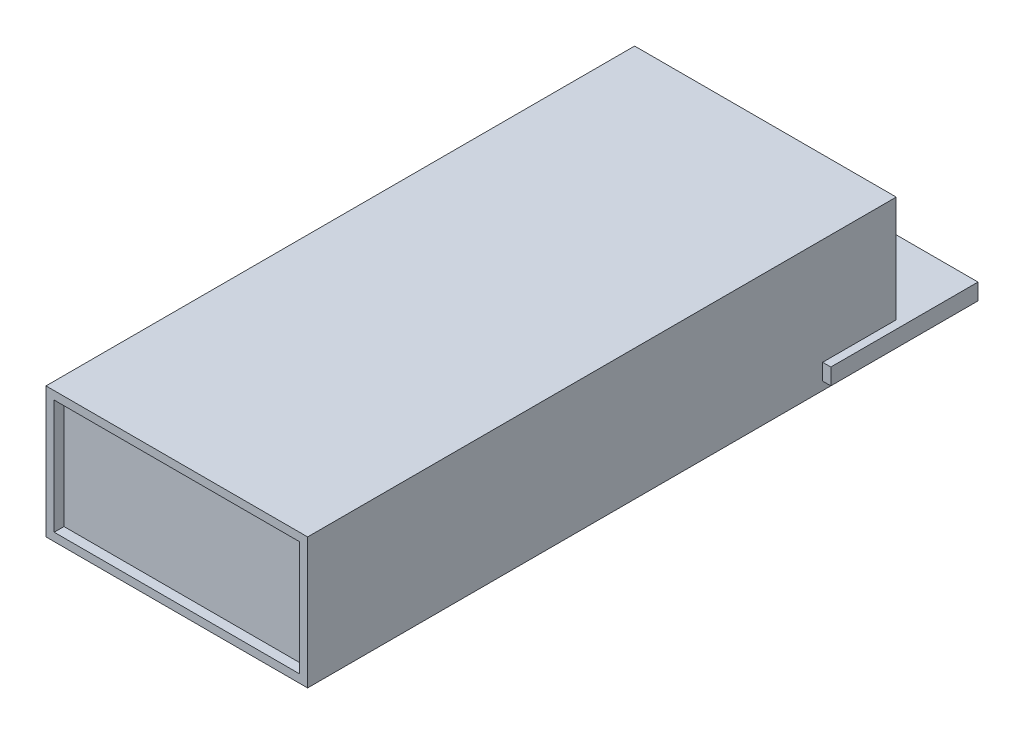
ISO-10303-21;
HEADER;
FILE_DESCRIPTION(('STEP AP214'),'2;1');
FILE_NAME('part.step','',(''),(''),'','','');
FILE_SCHEMA(('AUTOMOTIVE_DESIGN { 1 0 10303 214 1 1 1 1 }'));
ENDSEC;
DATA;
#1=APPLICATION_CONTEXT('core data for automotive mechanical design processes');
#2=APPLICATION_PROTOCOL_DEFINITION('international standard','automotive_design',2000,#1);
#3=PRODUCT_CONTEXT('',#1,'mechanical');
#4=PRODUCT('Part','Part','',(#3));
#5=PRODUCT_RELATED_PRODUCT_CATEGORY('part','',(#4));
#6=PRODUCT_DEFINITION_FORMATION('','',#4);
#7=PRODUCT_DEFINITION_CONTEXT('part definition',#1,'design');
#8=PRODUCT_DEFINITION('design','',#6,#7);
#9=PRODUCT_DEFINITION_SHAPE('','',#8);
#10=(LENGTH_UNIT() NAMED_UNIT(*) SI_UNIT(.MILLI.,.METRE.));
#11=(NAMED_UNIT(*) PLANE_ANGLE_UNIT() SI_UNIT($,.RADIAN.));
#12=(NAMED_UNIT(*) SI_UNIT($,.STERADIAN.) SOLID_ANGLE_UNIT());
#13=UNCERTAINTY_MEASURE_WITH_UNIT(LENGTH_MEASURE(1.E-05),#10,'distance_accuracy_value','');
#14=(GEOMETRIC_REPRESENTATION_CONTEXT(3) GLOBAL_UNCERTAINTY_ASSIGNED_CONTEXT((#13)) GLOBAL_UNIT_ASSIGNED_CONTEXT((#10,
#11,#12)) REPRESENTATION_CONTEXT('',''));
#15=CARTESIAN_POINT('',(0.,0.,0.));
#16=DIRECTION('',(0.,0.,1.));
#17=DIRECTION('',(1.,0.,0.));
#18=AXIS2_PLACEMENT_3D('',#15,#16,#17);
#19=CARTESIAN_POINT('',(400.,-200.,1800.));
#20=DIRECTION('',(-1.,0.,0.));
#21=DIRECTION('',(0.,0.,1.));
#22=AXIS2_PLACEMENT_3D('',#19,#20,#21);
#23=PLANE('',#22);
#24=DIRECTION('',(0.,0.,1.));
#25=VECTOR('',#24,1.);
#26=CARTESIAN_POINT('',(400.,-125.,1800.));
#27=LINE('',#26,#25);
#28=CARTESIAN_POINT('',(400.,-125.,0.));
#29=VERTEX_POINT('',#28);
#30=CARTESIAN_POINT('',(400.,-125.,225.));
#31=VERTEX_POINT('',#30);
#32=EDGE_CURVE('E190',#29,#31,#27,.T.);
#33=ORIENTED_EDGE('',*,*,#32,.F.);
#34=DIRECTION('',(0.,1.,0.));
#35=VECTOR('',#34,1.);
#36=CARTESIAN_POINT('',(400.,-200.,0.));
#37=LINE('',#36,#35);
#38=CARTESIAN_POINT('',(400.,200.,0.));
#39=VERTEX_POINT('',#38);
#40=EDGE_CURVE('E219',#29,#39,#37,.T.);
#41=ORIENTED_EDGE('',*,*,#40,.T.);
#42=DIRECTION('',(0.,0.,-1.));
#43=VECTOR('',#42,1.);
#44=CARTESIAN_POINT('',(400.,200.,1800.));
#45=LINE('',#44,#43);
#46=CARTESIAN_POINT('',(400.,200.,1800.));
#47=VERTEX_POINT('',#46);
#48=EDGE_CURVE('E254',#47,#39,#45,.T.);
#49=ORIENTED_EDGE('',*,*,#48,.F.);
#50=DIRECTION('',(0.,1.,0.));
#51=VECTOR('',#50,1.);
#52=CARTESIAN_POINT('',(400.,-200.,1800.));
#53=LINE('',#52,#51);
#54=CARTESIAN_POINT('',(400.,-200.,1800.));
#55=VERTEX_POINT('',#54);
#56=EDGE_CURVE('E226',#55,#47,#53,.T.);
#57=ORIENTED_EDGE('',*,*,#56,.F.);
#58=DIRECTION('',(0.,0.,-1.));
#59=VECTOR('',#58,1.);
#60=CARTESIAN_POINT('',(400.,-200.,1800.));
#61=LINE('',#60,#59);
#62=CARTESIAN_POINT('',(400.,-200.,0.));
#63=VERTEX_POINT('',#62);
#64=EDGE_CURVE('E236',#55,#63,#61,.T.);
#65=ORIENTED_EDGE('',*,*,#64,.T.);
#66=CARTESIAN_POINT('',(400.,-175.,0.));
#67=VERTEX_POINT('',#66);
#68=EDGE_CURVE('E237',#63,#67,#37,.T.);
#69=ORIENTED_EDGE('',*,*,#68,.T.);
#70=DIRECTION('',(0.,0.,1.));
#71=VECTOR('',#70,1.);
#72=CARTESIAN_POINT('',(400.,-175.,1800.));
#73=LINE('',#72,#71);
#74=CARTESIAN_POINT('',(400.,-175.,225.));
#75=VERTEX_POINT('',#74);
#76=EDGE_CURVE('E60',#67,#75,#73,.T.);
#77=ORIENTED_EDGE('',*,*,#76,.T.);
#78=DIRECTION('',(0.,-1.,0.));
#79=VECTOR('',#78,1.);
#80=CARTESIAN_POINT('',(400.,-200.,225.));
#81=LINE('',#80,#79);
#82=EDGE_CURVE('E55',#31,#75,#81,.T.);
#83=ORIENTED_EDGE('',*,*,#82,.F.);
#84=EDGE_LOOP('',(#33,#41,#49,#57,#65,#69,#77,#83));
#85=FACE_BOUND('',#84,.T.);
#86=ADVANCED_FACE('F41',(#85),#23,.F.);
#87=CARTESIAN_POINT('',(-400.,-200.,1800.));
#88=DIRECTION('',(1.,0.,0.));
#89=DIRECTION('',(0.,0.,-1.));
#90=AXIS2_PLACEMENT_3D('',#87,#88,#89);
#91=PLANE('',#90);
#92=DIRECTION('',(0.,0.,-1.));
#93=VECTOR('',#92,1.);
#94=CARTESIAN_POINT('',(-400.,-125.,1800.));
#95=LINE('',#94,#93);
#96=CARTESIAN_POINT('',(-400.,-125.,225.));
#97=VERTEX_POINT('',#96);
#98=CARTESIAN_POINT('',(-400.,-125.,0.));
#99=VERTEX_POINT('',#98);
#100=EDGE_CURVE('E187',#97,#99,#95,.T.);
#101=ORIENTED_EDGE('',*,*,#100,.F.);
#102=DIRECTION('',(0.,1.,0.));
#103=VECTOR('',#102,1.);
#104=CARTESIAN_POINT('',(-400.,-200.,225.));
#105=LINE('',#104,#103);
#106=CARTESIAN_POINT('',(-400.,-175.,225.));
#107=VERTEX_POINT('',#106);
#108=EDGE_CURVE('E11',#107,#97,#105,.T.);
#109=ORIENTED_EDGE('',*,*,#108,.F.);
#110=DIRECTION('',(0.,0.,-1.));
#111=VECTOR('',#110,1.);
#112=CARTESIAN_POINT('',(-400.,-175.,1800.));
#113=LINE('',#112,#111);
#114=CARTESIAN_POINT('',(-400.,-175.,0.));
#115=VERTEX_POINT('',#114);
#116=EDGE_CURVE('E178',#107,#115,#113,.T.);
#117=ORIENTED_EDGE('',*,*,#116,.T.);
#118=DIRECTION('',(0.,-1.,0.));
#119=VECTOR('',#118,1.);
#120=CARTESIAN_POINT('',(-400.,-200.,0.));
#121=LINE('',#120,#119);
#122=CARTESIAN_POINT('',(-400.,-200.,0.));
#123=VERTEX_POINT('',#122);
#124=EDGE_CURVE('E241',#115,#123,#121,.T.);
#125=ORIENTED_EDGE('',*,*,#124,.T.);
#126=DIRECTION('',(0.,0.,-1.));
#127=VECTOR('',#126,1.);
#128=CARTESIAN_POINT('',(-400.,-200.,1800.));
#129=LINE('',#128,#127);
#130=CARTESIAN_POINT('',(-400.,-200.,1800.));
#131=VERTEX_POINT('',#130);
#132=EDGE_CURVE('E248',#131,#123,#129,.T.);
#133=ORIENTED_EDGE('',*,*,#132,.F.);
#134=DIRECTION('',(0.,-1.,0.));
#135=VECTOR('',#134,1.);
#136=CARTESIAN_POINT('',(-400.,-200.,1800.));
#137=LINE('',#136,#135);
#138=CARTESIAN_POINT('',(-400.,200.,1800.));
#139=VERTEX_POINT('',#138);
#140=EDGE_CURVE('E232',#139,#131,#137,.T.);
#141=ORIENTED_EDGE('',*,*,#140,.F.);
#142=DIRECTION('',(0.,0.,-1.));
#143=VECTOR('',#142,1.);
#144=CARTESIAN_POINT('',(-400.,200.,1800.));
#145=LINE('',#144,#143);
#146=CARTESIAN_POINT('',(-400.,200.,0.));
#147=VERTEX_POINT('',#146);
#148=EDGE_CURVE('E251',#139,#147,#145,.T.);
#149=ORIENTED_EDGE('',*,*,#148,.T.);
#150=EDGE_CURVE('E242',#147,#99,#121,.T.);
#151=ORIENTED_EDGE('',*,*,#150,.T.);
#152=EDGE_LOOP('',(#101,#109,#117,#125,#133,#141,#149,#151));
#153=FACE_BOUND('',#152,.T.);
#154=ADVANCED_FACE('F265',(#153),#91,.F.);
#155=CARTESIAN_POINT('',(0.,0.,0.));
#156=DIRECTION('',(0.,0.,-1.));
#157=DIRECTION('',(-1.,0.,0.));
#158=AXIS2_PLACEMENT_3D('',#155,#156,#157);
#159=PLANE('',#158);
#160=ORIENTED_EDGE('',*,*,#40,.F.);
#161=DIRECTION('',(-1.,0.,0.));
#162=VECTOR('',#161,1.);
#163=CARTESIAN_POINT('',(0.,-125.,0.));
#164=LINE('',#163,#162);
#165=EDGE_CURVE('E48',#29,#99,#164,.T.);
#166=ORIENTED_EDGE('',*,*,#165,.T.);
#167=ORIENTED_EDGE('',*,*,#150,.F.);
#168=DIRECTION('',(-1.,0.,0.));
#169=VECTOR('',#168,1.);
#170=CARTESIAN_POINT('',(-400.,200.,0.));
#171=LINE('',#170,#169);
#172=EDGE_CURVE('E239',#39,#147,#171,.T.);
#173=ORIENTED_EDGE('',*,*,#172,.F.);
#174=EDGE_LOOP('',(#160,#166,#167,#173));
#175=FACE_BOUND('',#174,.T.);
#176=ADVANCED_FACE('F262',(#175),#159,.T.);
#177=CARTESIAN_POINT('',(-400.,200.,1800.));
#178=DIRECTION('',(0.,-1.,0.));
#179=DIRECTION('',(0.,0.,-1.));
#180=AXIS2_PLACEMENT_3D('',#177,#178,#179);
#181=PLANE('',#180);
#182=ORIENTED_EDGE('',*,*,#172,.T.);
#183=ORIENTED_EDGE('',*,*,#148,.F.);
#184=DIRECTION('',(-1.,0.,0.));
#185=VECTOR('',#184,1.);
#186=CARTESIAN_POINT('',(-400.,200.,1800.));
#187=LINE('',#186,#185);
#188=EDGE_CURVE('E229',#47,#139,#187,.T.);
#189=ORIENTED_EDGE('',*,*,#188,.F.);
#190=ORIENTED_EDGE('',*,*,#48,.T.);
#191=EDGE_LOOP('',(#182,#183,#189,#190));
#192=FACE_BOUND('',#191,.T.);
#193=ADVANCED_FACE('F328',(#192),#181,.F.);
#194=CARTESIAN_POINT('',(-400.,-200.,1800.));
#195=DIRECTION('',(0.,1.,0.));
#196=DIRECTION('',(0.,0.,1.));
#197=AXIS2_PLACEMENT_3D('',#194,#195,#196);
#198=PLANE('',#197);
#199=DIRECTION('',(1.,0.,0.));
#200=VECTOR('',#199,1.);
#201=CARTESIAN_POINT('',(-400.,-200.,0.));
#202=LINE('',#201,#200);
#203=EDGE_CURVE('E230',#123,#63,#202,.T.);
#204=ORIENTED_EDGE('',*,*,#203,.T.);
#205=ORIENTED_EDGE('',*,*,#64,.F.);
#206=DIRECTION('',(1.,0.,0.));
#207=VECTOR('',#206,1.);
#208=CARTESIAN_POINT('',(-400.,-200.,1800.));
#209=LINE('',#208,#207);
#210=EDGE_CURVE('E234',#131,#55,#209,.T.);
#211=ORIENTED_EDGE('',*,*,#210,.F.);
#212=ORIENTED_EDGE('',*,*,#132,.T.);
#213=EDGE_LOOP('',(#204,#205,#211,#212));
#214=FACE_BOUND('',#213,.T.);
#215=ADVANCED_FACE('F298',(#214),#198,.F.);
#216=CARTESIAN_POINT('',(0.,0.,1800.));
#217=DIRECTION('',(0.,0.,-1.));
#218=DIRECTION('',(-1.,0.,0.));
#219=AXIS2_PLACEMENT_3D('',#216,#217,#218);
#220=PLANE('',#219);
#221=DIRECTION('',(-1.,0.,0.));
#222=VECTOR('',#221,1.);
#223=CARTESIAN_POINT('',(-375.,175.,1800.));
#224=LINE('',#223,#222);
#225=CARTESIAN_POINT('',(375.,175.,1800.));
#226=VERTEX_POINT('',#225);
#227=CARTESIAN_POINT('',(-375.,175.,1800.));
#228=VERTEX_POINT('',#227);
#229=EDGE_CURVE('E209',#226,#228,#224,.T.);
#230=ORIENTED_EDGE('',*,*,#229,.F.);
#231=DIRECTION('',(0.,1.,0.));
#232=VECTOR('',#231,1.);
#233=CARTESIAN_POINT('',(375.,-175.,1800.));
#234=LINE('',#233,#232);
#235=CARTESIAN_POINT('',(375.,-175.,1800.));
#236=VERTEX_POINT('',#235);
#237=EDGE_CURVE('E193',#236,#226,#234,.T.);
#238=ORIENTED_EDGE('',*,*,#237,.F.);
#239=DIRECTION('',(1.,0.,0.));
#240=VECTOR('',#239,1.);
#241=CARTESIAN_POINT('',(-375.,-175.,1800.));
#242=LINE('',#241,#240);
#243=CARTESIAN_POINT('',(-375.,-175.,1800.));
#244=VERTEX_POINT('',#243);
#245=EDGE_CURVE('E198',#244,#236,#242,.T.);
#246=ORIENTED_EDGE('',*,*,#245,.F.);
#247=DIRECTION('',(0.,-1.,0.));
#248=VECTOR('',#247,1.);
#249=CARTESIAN_POINT('',(-375.,-175.,1800.));
#250=LINE('',#249,#248);
#251=EDGE_CURVE('E212',#228,#244,#250,.T.);
#252=ORIENTED_EDGE('',*,*,#251,.F.);
#253=EDGE_LOOP('',(#230,#238,#246,#252));
#254=FACE_BOUND('',#253,.T.);
#255=ORIENTED_EDGE('',*,*,#56,.T.);
#256=ORIENTED_EDGE('',*,*,#188,.T.);
#257=ORIENTED_EDGE('',*,*,#140,.T.);
#258=ORIENTED_EDGE('',*,*,#210,.T.);
#259=EDGE_LOOP('',(#255,#256,#257,#258));
#260=FACE_BOUND('',#259,.T.);
#261=ADVANCED_FACE('F336',(#254,#260),#220,.F.);
#262=DIRECTION('',(-1.,0.,0.));
#263=VECTOR('',#262,1.);
#264=CARTESIAN_POINT('',(0.,-175.,0.));
#265=LINE('',#264,#263);
#266=EDGE_CURVE('E257',#67,#115,#265,.T.);
#267=ORIENTED_EDGE('',*,*,#266,.F.);
#268=ORIENTED_EDGE('',*,*,#68,.F.);
#269=ORIENTED_EDGE('',*,*,#203,.F.);
#270=ORIENTED_EDGE('',*,*,#124,.F.);
#271=EDGE_LOOP('',(#267,#268,#269,#270));
#272=FACE_BOUND('',#271,.T.);
#273=ADVANCED_FACE('F301',(#272),#159,.T.);
#274=CARTESIAN_POINT('',(375.,-175.,1770.));
#275=DIRECTION('',(1.,0.,0.));
#276=DIRECTION('',(0.,0.,-1.));
#277=AXIS2_PLACEMENT_3D('',#274,#275,#276);
#278=PLANE('',#277);
#279=ORIENTED_EDGE('',*,*,#237,.T.);
#280=DIRECTION('',(0.,0.,1.));
#281=VECTOR('',#280,1.);
#282=CARTESIAN_POINT('',(375.,175.,1770.));
#283=LINE('',#282,#281);
#284=CARTESIAN_POINT('',(375.,175.,1770.));
#285=VERTEX_POINT('',#284);
#286=EDGE_CURVE('E207',#285,#226,#283,.T.);
#287=ORIENTED_EDGE('',*,*,#286,.F.);
#288=DIRECTION('',(0.,1.,0.));
#289=VECTOR('',#288,1.);
#290=CARTESIAN_POINT('',(375.,-175.,1770.));
#291=LINE('',#290,#289);
#292=CARTESIAN_POINT('',(375.,-175.,1770.));
#293=VERTEX_POINT('',#292);
#294=EDGE_CURVE('E194',#293,#285,#291,.T.);
#295=ORIENTED_EDGE('',*,*,#294,.F.);
#296=DIRECTION('',(0.,0.,1.));
#297=VECTOR('',#296,1.);
#298=CARTESIAN_POINT('',(375.,-175.,1770.));
#299=LINE('',#298,#297);
#300=EDGE_CURVE('E217',#293,#236,#299,.T.);
#301=ORIENTED_EDGE('',*,*,#300,.T.);
#302=EDGE_LOOP('',(#279,#287,#295,#301));
#303=FACE_BOUND('',#302,.T.);
#304=ADVANCED_FACE('F344',(#303),#278,.F.);
#305=CARTESIAN_POINT('',(-375.,-175.,1770.));
#306=DIRECTION('',(0.,-1.,0.));
#307=DIRECTION('',(0.,0.,-1.));
#308=AXIS2_PLACEMENT_3D('',#305,#306,#307);
#309=PLANE('',#308);
#310=ORIENTED_EDGE('',*,*,#245,.T.);
#311=ORIENTED_EDGE('',*,*,#300,.F.);
#312=DIRECTION('',(1.,0.,0.));
#313=VECTOR('',#312,1.);
#314=CARTESIAN_POINT('',(-375.,-175.,1770.));
#315=LINE('',#314,#313);
#316=CARTESIAN_POINT('',(-375.,-175.,1770.));
#317=VERTEX_POINT('',#316);
#318=EDGE_CURVE('E204',#317,#293,#315,.T.);
#319=ORIENTED_EDGE('',*,*,#318,.F.);
#320=DIRECTION('',(0.,0.,1.));
#321=VECTOR('',#320,1.);
#322=CARTESIAN_POINT('',(-375.,-175.,1770.));
#323=LINE('',#322,#321);
#324=EDGE_CURVE('E220',#317,#244,#323,.T.);
#325=ORIENTED_EDGE('',*,*,#324,.T.);
#326=EDGE_LOOP('',(#310,#311,#319,#325));
#327=FACE_BOUND('',#326,.T.);
#328=ADVANCED_FACE('F348',(#327),#309,.F.);
#329=CARTESIAN_POINT('',(-375.,-175.,1770.));
#330=DIRECTION('',(-1.,0.,0.));
#331=DIRECTION('',(0.,0.,1.));
#332=AXIS2_PLACEMENT_3D('',#329,#330,#331);
#333=PLANE('',#332);
#334=ORIENTED_EDGE('',*,*,#251,.T.);
#335=ORIENTED_EDGE('',*,*,#324,.F.);
#336=DIRECTION('',(0.,-1.,0.));
#337=VECTOR('',#336,1.);
#338=CARTESIAN_POINT('',(-375.,-175.,1770.));
#339=LINE('',#338,#337);
#340=CARTESIAN_POINT('',(-375.,175.,1770.));
#341=VERTEX_POINT('',#340);
#342=EDGE_CURVE('E201',#341,#317,#339,.T.);
#343=ORIENTED_EDGE('',*,*,#342,.F.);
#344=DIRECTION('',(0.,0.,1.));
#345=VECTOR('',#344,1.);
#346=CARTESIAN_POINT('',(-375.,175.,1770.));
#347=LINE('',#346,#345);
#348=EDGE_CURVE('E222',#341,#228,#347,.T.);
#349=ORIENTED_EDGE('',*,*,#348,.T.);
#350=EDGE_LOOP('',(#334,#335,#343,#349));
#351=FACE_BOUND('',#350,.T.);
#352=ADVANCED_FACE('F352',(#351),#333,.F.);
#353=CARTESIAN_POINT('',(-375.,175.,1770.));
#354=DIRECTION('',(0.,1.,0.));
#355=DIRECTION('',(0.,0.,1.));
#356=AXIS2_PLACEMENT_3D('',#353,#354,#355);
#357=PLANE('',#356);
#358=ORIENTED_EDGE('',*,*,#229,.T.);
#359=ORIENTED_EDGE('',*,*,#348,.F.);
#360=DIRECTION('',(-1.,0.,0.));
#361=VECTOR('',#360,1.);
#362=CARTESIAN_POINT('',(-375.,175.,1770.));
#363=LINE('',#362,#361);
#364=EDGE_CURVE('E197',#285,#341,#363,.T.);
#365=ORIENTED_EDGE('',*,*,#364,.F.);
#366=ORIENTED_EDGE('',*,*,#286,.T.);
#367=EDGE_LOOP('',(#358,#359,#365,#366));
#368=FACE_BOUND('',#367,.T.);
#369=ADVANCED_FACE('F314',(#368),#357,.F.);
#370=CARTESIAN_POINT('',(0.,0.,1770.));
#371=DIRECTION('',(0.,0.,-1.));
#372=DIRECTION('',(-1.,0.,0.));
#373=AXIS2_PLACEMENT_3D('',#370,#371,#372);
#374=PLANE('',#373);
#375=ORIENTED_EDGE('',*,*,#294,.T.);
#376=ORIENTED_EDGE('',*,*,#364,.T.);
#377=ORIENTED_EDGE('',*,*,#342,.T.);
#378=ORIENTED_EDGE('',*,*,#318,.T.);
#379=EDGE_LOOP('',(#375,#376,#377,#378));
#380=FACE_BOUND('',#379,.T.);
#381=ADVANCED_FACE('F307',(#380),#374,.F.);
#382=CARTESIAN_POINT('',(-425.,-125.,225.));
#383=DIRECTION('',(0.,0.,-1.));
#384=DIRECTION('',(-1.,0.,0.));
#385=AXIS2_PLACEMENT_3D('',#382,#383,#384);
#386=PLANE('',#385);
#387=DIRECTION('',(1.,0.,0.));
#388=VECTOR('',#387,1.);
#389=CARTESIAN_POINT('',(-425.,-125.,225.));
#390=LINE('',#389,#388);
#391=CARTESIAN_POINT('',(425.,-125.,225.));
#392=VERTEX_POINT('',#391);
#393=EDGE_CURVE('E169',#31,#392,#390,.T.);
#394=ORIENTED_EDGE('',*,*,#393,.F.);
#395=ORIENTED_EDGE('',*,*,#82,.T.);
#396=DIRECTION('',(1.,0.,0.));
#397=VECTOR('',#396,1.);
#398=CARTESIAN_POINT('',(-425.,-175.,225.));
#399=LINE('',#398,#397);
#400=CARTESIAN_POINT('',(425.,-175.,225.));
#401=VERTEX_POINT('',#400);
#402=EDGE_CURVE('E284',#75,#401,#399,.T.);
#403=ORIENTED_EDGE('',*,*,#402,.T.);
#404=DIRECTION('',(0.,-1.,0.));
#405=VECTOR('',#404,1.);
#406=CARTESIAN_POINT('',(425.,-125.,225.));
#407=LINE('',#406,#405);
#408=EDGE_CURVE('E274',#392,#401,#407,.T.);
#409=ORIENTED_EDGE('',*,*,#408,.F.);
#410=EDGE_LOOP('',(#394,#395,#403,#409));
#411=FACE_BOUND('',#410,.T.);
#412=ADVANCED_FACE('F305',(#411),#386,.F.);
#413=CARTESIAN_POINT('',(-425.,-175.,225.));
#414=VERTEX_POINT('',#413);
#415=EDGE_CURVE('E173',#414,#107,#399,.T.);
#416=ORIENTED_EDGE('',*,*,#415,.T.);
#417=ORIENTED_EDGE('',*,*,#108,.T.);
#418=CARTESIAN_POINT('',(-425.,-125.,225.));
#419=VERTEX_POINT('',#418);
#420=EDGE_CURVE('E270',#419,#97,#390,.T.);
#421=ORIENTED_EDGE('',*,*,#420,.F.);
#422=DIRECTION('',(0.,-1.,0.));
#423=VECTOR('',#422,1.);
#424=CARTESIAN_POINT('',(-425.,-125.,225.));
#425=LINE('',#424,#423);
#426=EDGE_CURVE('E182',#419,#414,#425,.T.);
#427=ORIENTED_EDGE('',*,*,#426,.T.);
#428=EDGE_LOOP('',(#416,#417,#421,#427));
#429=FACE_BOUND('',#428,.T.);
#430=ADVANCED_FACE('F287',(#429),#386,.F.);
#431=CARTESIAN_POINT('',(0.,-125.,0.));
#432=DIRECTION('',(0.,-1.,0.));
#433=DIRECTION('',(0.,0.,-1.));
#434=AXIS2_PLACEMENT_3D('',#431,#432,#433);
#435=PLANE('',#434);
#436=ORIENTED_EDGE('',*,*,#165,.F.);
#437=ORIENTED_EDGE('',*,*,#32,.T.);
#438=ORIENTED_EDGE('',*,*,#393,.T.);
#439=DIRECTION('',(0.,0.,-1.));
#440=VECTOR('',#439,1.);
#441=CARTESIAN_POINT('',(425.,-125.,225.));
#442=LINE('',#441,#440);
#443=CARTESIAN_POINT('',(425.,-125.,-225.));
#444=VERTEX_POINT('',#443);
#445=EDGE_CURVE('E163',#392,#444,#442,.T.);
#446=ORIENTED_EDGE('',*,*,#445,.T.);
#447=DIRECTION('',(-1.,0.,0.));
#448=VECTOR('',#447,1.);
#449=CARTESIAN_POINT('',(-425.,-125.,-225.));
#450=LINE('',#449,#448);
#451=CARTESIAN_POINT('',(-425.,-125.,-225.));
#452=VERTEX_POINT('',#451);
#453=EDGE_CURVE('E152',#444,#452,#450,.T.);
#454=ORIENTED_EDGE('',*,*,#453,.T.);
#455=DIRECTION('',(0.,0.,1.));
#456=VECTOR('',#455,1.);
#457=CARTESIAN_POINT('',(-425.,-125.,225.));
#458=LINE('',#457,#456);
#459=EDGE_CURVE('E162',#452,#419,#458,.T.);
#460=ORIENTED_EDGE('',*,*,#459,.T.);
#461=ORIENTED_EDGE('',*,*,#420,.T.);
#462=ORIENTED_EDGE('',*,*,#100,.T.);
#463=EDGE_LOOP('',(#436,#437,#438,#446,#454,#460,#461,#462));
#464=FACE_BOUND('',#463,.T.);
#465=ADVANCED_FACE('F167',(#464),#435,.F.);
#466=CARTESIAN_POINT('',(0.,-175.,0.));
#467=DIRECTION('',(0.,-1.,0.));
#468=DIRECTION('',(0.,0.,-1.));
#469=AXIS2_PLACEMENT_3D('',#466,#467,#468);
#470=PLANE('',#469);
#471=ORIENTED_EDGE('',*,*,#76,.F.);
#472=ORIENTED_EDGE('',*,*,#266,.T.);
#473=ORIENTED_EDGE('',*,*,#116,.F.);
#474=ORIENTED_EDGE('',*,*,#415,.F.);
#475=DIRECTION('',(0.,0.,1.));
#476=VECTOR('',#475,1.);
#477=CARTESIAN_POINT('',(-425.,-175.,225.));
#478=LINE('',#477,#476);
#479=CARTESIAN_POINT('',(-425.,-175.,-225.));
#480=VERTEX_POINT('',#479);
#481=EDGE_CURVE('E282',#480,#414,#478,.T.);
#482=ORIENTED_EDGE('',*,*,#481,.F.);
#483=DIRECTION('',(-1.,0.,0.));
#484=VECTOR('',#483,1.);
#485=CARTESIAN_POINT('',(-425.,-175.,-225.));
#486=LINE('',#485,#484);
#487=CARTESIAN_POINT('',(425.,-175.,-225.));
#488=VERTEX_POINT('',#487);
#489=EDGE_CURVE('E280',#488,#480,#486,.T.);
#490=ORIENTED_EDGE('',*,*,#489,.F.);
#491=DIRECTION('',(0.,0.,-1.));
#492=VECTOR('',#491,1.);
#493=CARTESIAN_POINT('',(425.,-175.,225.));
#494=LINE('',#493,#492);
#495=EDGE_CURVE('E177',#401,#488,#494,.T.);
#496=ORIENTED_EDGE('',*,*,#495,.F.);
#497=ORIENTED_EDGE('',*,*,#402,.F.);
#498=EDGE_LOOP('',(#471,#472,#473,#474,#482,#490,#496,#497));
#499=FACE_BOUND('',#498,.T.);
#500=ADVANCED_FACE('F292',(#499),#470,.T.);
#501=CARTESIAN_POINT('',(425.,-125.,225.));
#502=DIRECTION('',(-1.,0.,0.));
#503=DIRECTION('',(0.,0.,1.));
#504=AXIS2_PLACEMENT_3D('',#501,#502,#503);
#505=PLANE('',#504);
#506=ORIENTED_EDGE('',*,*,#495,.T.);
#507=DIRECTION('',(0.,-1.,0.));
#508=VECTOR('',#507,1.);
#509=CARTESIAN_POINT('',(425.,-125.,-225.));
#510=LINE('',#509,#508);
#511=EDGE_CURVE('E156',#444,#488,#510,.T.);
#512=ORIENTED_EDGE('',*,*,#511,.F.);
#513=ORIENTED_EDGE('',*,*,#445,.F.);
#514=ORIENTED_EDGE('',*,*,#408,.T.);
#515=EDGE_LOOP('',(#506,#512,#513,#514));
#516=FACE_BOUND('',#515,.T.);
#517=ADVANCED_FACE('F175',(#516),#505,.F.);
#518=CARTESIAN_POINT('',(-425.,-125.,-225.));
#519=DIRECTION('',(0.,0.,1.));
#520=DIRECTION('',(1.,0.,0.));
#521=AXIS2_PLACEMENT_3D('',#518,#519,#520);
#522=PLANE('',#521);
#523=ORIENTED_EDGE('',*,*,#489,.T.);
#524=DIRECTION('',(0.,-1.,0.));
#525=VECTOR('',#524,1.);
#526=CARTESIAN_POINT('',(-425.,-125.,-225.));
#527=LINE('',#526,#525);
#528=EDGE_CURVE('E159',#452,#480,#527,.T.);
#529=ORIENTED_EDGE('',*,*,#528,.F.);
#530=ORIENTED_EDGE('',*,*,#453,.F.);
#531=ORIENTED_EDGE('',*,*,#511,.T.);
#532=EDGE_LOOP('',(#523,#529,#530,#531));
#533=FACE_BOUND('',#532,.T.);
#534=ADVANCED_FACE('F154',(#533),#522,.F.);
#535=CARTESIAN_POINT('',(-425.,-125.,225.));
#536=DIRECTION('',(1.,0.,0.));
#537=DIRECTION('',(0.,0.,-1.));
#538=AXIS2_PLACEMENT_3D('',#535,#536,#537);
#539=PLANE('',#538);
#540=ORIENTED_EDGE('',*,*,#481,.T.);
#541=ORIENTED_EDGE('',*,*,#426,.F.);
#542=ORIENTED_EDGE('',*,*,#459,.F.);
#543=ORIENTED_EDGE('',*,*,#528,.T.);
#544=EDGE_LOOP('',(#540,#541,#542,#543));
#545=FACE_BOUND('',#544,.T.);
#546=ADVANCED_FACE('F363',(#545),#539,.F.);
#547=CLOSED_SHELL('',(#86,#154,#176,#193,#215,#261,#273,#304,#328,#352,#369,#381,#412,#430,#465,
#500,#517,#534,#546));
#548=MANIFOLD_SOLID_BREP('B2',#547);
#549=ADVANCED_BREP_SHAPE_REPRESENTATION('',(#18,#548),#14);
#550=SHAPE_DEFINITION_REPRESENTATION(#9,#549);
ENDSEC;
END-ISO-10303-21;
